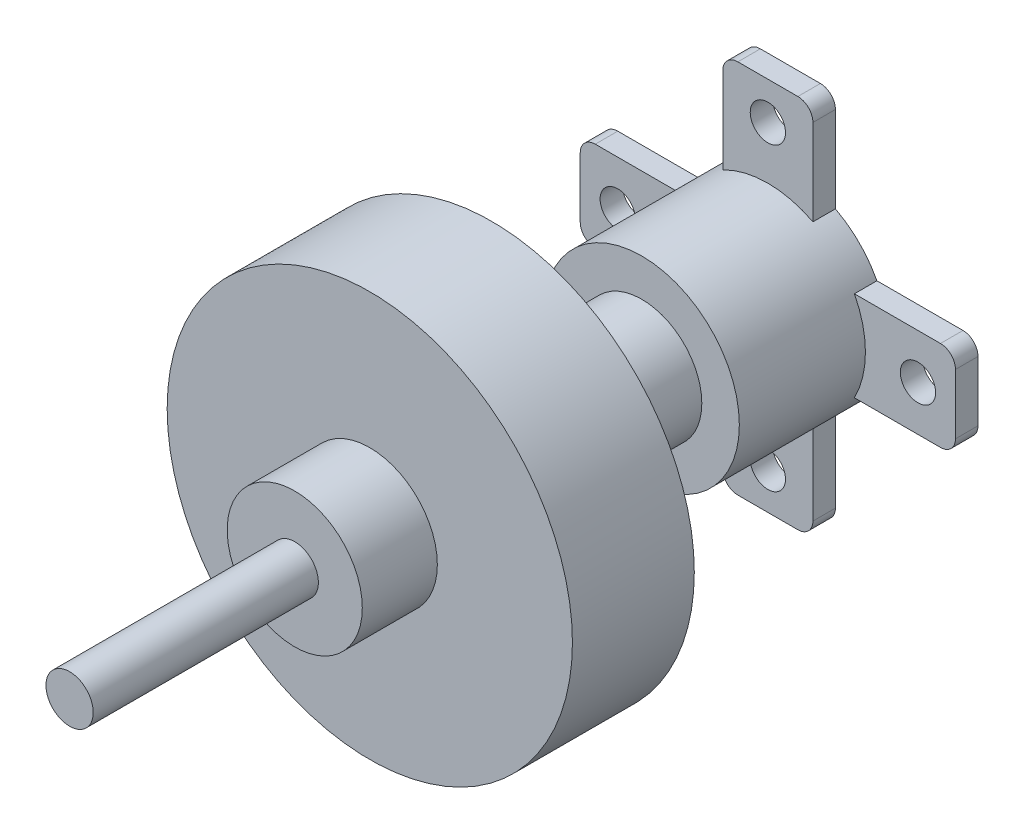
ISO-10303-21;
HEADER;
FILE_DESCRIPTION(('STEP AP214'),'2;1');
FILE_NAME('part.step','',(''),(''),'','','');
FILE_SCHEMA(('AUTOMOTIVE_DESIGN { 1 0 10303 214 1 1 1 1 }'));
ENDSEC;
DATA;
#1=APPLICATION_CONTEXT('core data for automotive mechanical design processes');
#2=APPLICATION_PROTOCOL_DEFINITION('international standard','automotive_design',2000,#1);
#3=PRODUCT_CONTEXT('',#1,'mechanical');
#4=PRODUCT('Part','Part','',(#3));
#5=PRODUCT_RELATED_PRODUCT_CATEGORY('part','',(#4));
#6=PRODUCT_DEFINITION_FORMATION('','',#4);
#7=PRODUCT_DEFINITION_CONTEXT('part definition',#1,'design');
#8=PRODUCT_DEFINITION('design','',#6,#7);
#9=PRODUCT_DEFINITION_SHAPE('','',#8);
#10=(LENGTH_UNIT() NAMED_UNIT(*) SI_UNIT(.MILLI.,.METRE.));
#11=(NAMED_UNIT(*) PLANE_ANGLE_UNIT() SI_UNIT($,.RADIAN.));
#12=(NAMED_UNIT(*) SI_UNIT($,.STERADIAN.) SOLID_ANGLE_UNIT());
#13=UNCERTAINTY_MEASURE_WITH_UNIT(LENGTH_MEASURE(1.E-05),#10,'distance_accuracy_value','');
#14=(GEOMETRIC_REPRESENTATION_CONTEXT(3) GLOBAL_UNCERTAINTY_ASSIGNED_CONTEXT((#13)) GLOBAL_UNIT_ASSIGNED_CONTEXT((#10,
#11,#12)) REPRESENTATION_CONTEXT('',''));
#15=CARTESIAN_POINT('',(0.,0.,0.));
#16=DIRECTION('',(0.,0.,1.));
#17=DIRECTION('',(1.,0.,0.));
#18=AXIS2_PLACEMENT_3D('',#15,#16,#17);
#19=CARTESIAN_POINT('',(0.,0.,31.52));
#20=DIRECTION('',(0.,0.,1.));
#21=DIRECTION('',(1.,0.,0.));
#22=AXIS2_PLACEMENT_3D('',#19,#20,#21);
#23=PLANE('',#22);
#24=CARTESIAN_POINT('',(0.,0.,31.52));
#25=DIRECTION('',(0.,0.,1.));
#26=DIRECTION('',(1.,0.,0.));
#27=AXIS2_PLACEMENT_3D('',#24,#25,#26);
#28=CIRCLE('',#27,4.5);
#29=CARTESIAN_POINT('',(4.5,0.,31.52));
#30=VERTEX_POINT('',#29);
#31=EDGE_CURVE('E56',#30,#30,#28,.T.);
#32=ORIENTED_EDGE('',*,*,#31,.T.);
#33=EDGE_LOOP('',(#32));
#34=FACE_BOUND('',#33,.T.);
#35=CARTESIAN_POINT('',(0.,0.,31.52));
#36=DIRECTION('',(0.,0.,1.));
#37=DIRECTION('',(1.,0.,0.));
#38=AXIS2_PLACEMENT_3D('',#35,#36,#37);
#39=CIRCLE('',#38,1.575);
#40=CARTESIAN_POINT('',(1.575,0.,31.52));
#41=VERTEX_POINT('',#40);
#42=EDGE_CURVE('E65',#41,#41,#39,.T.);
#43=ORIENTED_EDGE('',*,*,#42,.F.);
#44=EDGE_LOOP('',(#43));
#45=FACE_BOUND('',#44,.T.);
#46=ADVANCED_FACE('F40',(#34,#45),#23,.T.);
#47=CARTESIAN_POINT('',(0.,0.,26.52));
#48=DIRECTION('',(0.,0.,1.));
#49=DIRECTION('',(1.,0.,0.));
#50=AXIS2_PLACEMENT_3D('',#47,#48,#49);
#51=PLANE('',#50);
#52=CARTESIAN_POINT('',(0.,0.,26.52));
#53=DIRECTION('',(0.,0.,1.));
#54=DIRECTION('',(1.,0.,0.));
#55=AXIS2_PLACEMENT_3D('',#52,#53,#54);
#56=CIRCLE('',#55,13.5);
#57=CARTESIAN_POINT('',(13.5,0.,26.52));
#58=VERTEX_POINT('',#57);
#59=EDGE_CURVE('E51',#58,#58,#56,.T.);
#60=ORIENTED_EDGE('',*,*,#59,.T.);
#61=EDGE_LOOP('',(#60));
#62=FACE_BOUND('',#61,.T.);
#63=CARTESIAN_POINT('',(0.,0.,26.52));
#64=DIRECTION('',(0.,0.,1.));
#65=DIRECTION('',(1.,0.,0.));
#66=AXIS2_PLACEMENT_3D('',#63,#64,#65);
#67=CIRCLE('',#66,4.5);
#68=CARTESIAN_POINT('',(4.5,0.,26.52));
#69=VERTEX_POINT('',#68);
#70=EDGE_CURVE('E59',#69,#69,#67,.T.);
#71=ORIENTED_EDGE('',*,*,#70,.F.);
#72=EDGE_LOOP('',(#71));
#73=FACE_BOUND('',#72,.T.);
#74=ADVANCED_FACE('F81',(#62,#73),#51,.T.);
#75=CARTESIAN_POINT('',(0.,0.,18.4));
#76=DIRECTION('',(0.,0.,-1.));
#77=DIRECTION('',(-1.,0.,0.));
#78=AXIS2_PLACEMENT_3D('',#75,#76,#77);
#79=CYLINDRICAL_SURFACE('',#78,4.);
#80=CARTESIAN_POINT('',(0.,0.,18.4));
#81=DIRECTION('',(0.,0.,1.));
#82=DIRECTION('',(1.,0.,0.));
#83=AXIS2_PLACEMENT_3D('',#80,#81,#82);
#84=CIRCLE('',#83,4.);
#85=CARTESIAN_POINT('',(4.,0.,18.4));
#86=VERTEX_POINT('',#85);
#87=EDGE_CURVE('E11',#86,#86,#84,.T.);
#88=ORIENTED_EDGE('',*,*,#87,.F.);
#89=EDGE_LOOP('',(#88));
#90=FACE_BOUND('',#89,.T.);
#91=CARTESIAN_POINT('',(0.,0.,8.4));
#92=DIRECTION('',(0.,0.,1.));
#93=DIRECTION('',(1.,0.,0.));
#94=AXIS2_PLACEMENT_3D('',#91,#92,#93);
#95=CIRCLE('',#94,4.);
#96=CARTESIAN_POINT('',(4.,0.,8.4));
#97=VERTEX_POINT('',#96);
#98=EDGE_CURVE('E44',#97,#97,#95,.T.);
#99=ORIENTED_EDGE('',*,*,#98,.T.);
#100=EDGE_LOOP('',(#99));
#101=FACE_BOUND('',#100,.T.);
#102=ADVANCED_FACE('F42',(#90,#101),#79,.T.);
#103=CARTESIAN_POINT('',(0.,0.,8.4));
#104=DIRECTION('',(0.,0.,1.));
#105=DIRECTION('',(1.,0.,0.));
#106=AXIS2_PLACEMENT_3D('',#103,#104,#105);
#107=PLANE('',#106);
#108=ORIENTED_EDGE('',*,*,#98,.F.);
#109=EDGE_LOOP('',(#108));
#110=FACE_BOUND('',#109,.T.);
#111=ADVANCED_FACE('F98',(#110),#107,.F.);
#112=CARTESIAN_POINT('',(0.,0.,18.4));
#113=DIRECTION('',(0.,0.,1.));
#114=DIRECTION('',(1.,0.,0.));
#115=AXIS2_PLACEMENT_3D('',#112,#113,#114);
#116=PLANE('',#115);
#117=CARTESIAN_POINT('',(0.,0.,18.4));
#118=DIRECTION('',(0.,0.,1.));
#119=DIRECTION('',(1.,0.,0.));
#120=AXIS2_PLACEMENT_3D('',#117,#118,#119);
#121=CIRCLE('',#120,13.5);
#122=CARTESIAN_POINT('',(13.5,0.,18.4));
#123=VERTEX_POINT('',#122);
#124=EDGE_CURVE('E53',#123,#123,#121,.T.);
#125=ORIENTED_EDGE('',*,*,#124,.F.);
#126=EDGE_LOOP('',(#125));
#127=FACE_BOUND('',#126,.T.);
#128=ORIENTED_EDGE('',*,*,#87,.T.);
#129=EDGE_LOOP('',(#128));
#130=FACE_BOUND('',#129,.T.);
#131=ADVANCED_FACE('F95',(#127,#130),#116,.F.);
#132=CARTESIAN_POINT('',(0.,0.,26.52));
#133=DIRECTION('',(0.,0.,-1.));
#134=DIRECTION('',(-1.,0.,0.));
#135=AXIS2_PLACEMENT_3D('',#132,#133,#134);
#136=CYLINDRICAL_SURFACE('',#135,13.5);
#137=ORIENTED_EDGE('',*,*,#59,.F.);
#138=EDGE_LOOP('',(#137));
#139=FACE_BOUND('',#138,.T.);
#140=ORIENTED_EDGE('',*,*,#124,.T.);
#141=EDGE_LOOP('',(#140));
#142=FACE_BOUND('',#141,.T.);
#143=ADVANCED_FACE('F92',(#139,#142),#136,.T.);
#144=CARTESIAN_POINT('',(0.,0.,31.52));
#145=DIRECTION('',(0.,0.,-1.));
#146=DIRECTION('',(-1.,0.,0.));
#147=AXIS2_PLACEMENT_3D('',#144,#145,#146);
#148=CYLINDRICAL_SURFACE('',#147,4.5);
#149=ORIENTED_EDGE('',*,*,#31,.F.);
#150=EDGE_LOOP('',(#149));
#151=FACE_BOUND('',#150,.T.);
#152=ORIENTED_EDGE('',*,*,#70,.T.);
#153=EDGE_LOOP('',(#152));
#154=FACE_BOUND('',#153,.T.);
#155=ADVANCED_FACE('F76',(#151,#154),#148,.T.);
#156=CARTESIAN_POINT('',(0.,0.,46.52));
#157=DIRECTION('',(0.,0.,-1.));
#158=DIRECTION('',(-1.,0.,0.));
#159=AXIS2_PLACEMENT_3D('',#156,#157,#158);
#160=CYLINDRICAL_SURFACE('',#159,1.575);
#161=CARTESIAN_POINT('',(0.,0.,46.52));
#162=DIRECTION('',(0.,0.,1.));
#163=DIRECTION('',(1.,0.,0.));
#164=AXIS2_PLACEMENT_3D('',#161,#162,#163);
#165=CIRCLE('',#164,1.575);
#166=CARTESIAN_POINT('',(1.575,0.,46.52));
#167=VERTEX_POINT('',#166);
#168=EDGE_CURVE('E62',#167,#167,#165,.T.);
#169=ORIENTED_EDGE('',*,*,#168,.F.);
#170=EDGE_LOOP('',(#169));
#171=FACE_BOUND('',#170,.T.);
#172=ORIENTED_EDGE('',*,*,#42,.T.);
#173=EDGE_LOOP('',(#172));
#174=FACE_BOUND('',#173,.T.);
#175=ADVANCED_FACE('F73',(#171,#174),#160,.T.);
#176=CARTESIAN_POINT('',(0.,0.,46.52));
#177=DIRECTION('',(0.,0.,1.));
#178=DIRECTION('',(1.,0.,0.));
#179=AXIS2_PLACEMENT_3D('',#176,#177,#178);
#180=PLANE('',#179);
#181=ORIENTED_EDGE('',*,*,#168,.T.);
#182=EDGE_LOOP('',(#181));
#183=FACE_BOUND('',#182,.T.);
#184=ADVANCED_FACE('F71',(#183),#180,.T.);
#185=CLOSED_SHELL('',(#46,#74,#102,#111,#131,#143,#155,#175,#184));
#186=MANIFOLD_SOLID_BREP('B2',#185);
#187=CARTESIAN_POINT('',(0.,0.,8.4));
#188=DIRECTION('',(0.,0.,1.));
#189=DIRECTION('',(1.,0.,0.));
#190=AXIS2_PLACEMENT_3D('',#187,#188,#189);
#191=PLANE('',#190);
#192=CARTESIAN_POINT('',(0.,0.,8.4));
#193=DIRECTION('',(0.,0.,1.));
#194=DIRECTION('',(1.,0.,0.));
#195=AXIS2_PLACEMENT_3D('',#192,#193,#194);
#196=CIRCLE('',#195,6.5);
#197=CARTESIAN_POINT('',(6.5,0.,8.4));
#198=VERTEX_POINT('',#197);
#199=EDGE_CURVE('E38',#198,#198,#196,.T.);
#200=ORIENTED_EDGE('',*,*,#199,.T.);
#201=EDGE_LOOP('',(#200));
#202=FACE_BOUND('',#201,.T.);
#203=CARTESIAN_POINT('',(0.,0.,8.4));
#204=DIRECTION('',(0.,0.,1.));
#205=DIRECTION('',(1.,0.,0.));
#206=AXIS2_PLACEMENT_3D('',#203,#204,#205);
#207=CIRCLE('',#206,4.);
#208=CARTESIAN_POINT('',(4.,0.,8.4));
#209=VERTEX_POINT('',#208);
#210=EDGE_CURVE('E448',#209,#209,#207,.T.);
#211=ORIENTED_EDGE('',*,*,#210,.F.);
#212=EDGE_LOOP('',(#211));
#213=FACE_BOUND('',#212,.T.);
#214=ADVANCED_FACE('F170',(#202,#213),#191,.T.);
#215=CARTESIAN_POINT('',(0.,0.,8.4));
#216=DIRECTION('',(0.,0.,-1.));
#217=DIRECTION('',(-1.,0.,0.));
#218=AXIS2_PLACEMENT_3D('',#215,#216,#217);
#219=CYLINDRICAL_SURFACE('',#218,6.5);
#220=ORIENTED_EDGE('',*,*,#199,.F.);
#221=EDGE_LOOP('',(#220));
#222=FACE_BOUND('',#221,.T.);
#223=CARTESIAN_POINT('',(0.,0.,0.));
#224=DIRECTION('',(0.,0.,1.));
#225=DIRECTION('',(1.,0.,0.));
#226=AXIS2_PLACEMENT_3D('',#223,#224,#225);
#227=CIRCLE('',#226,6.5);
#228=CARTESIAN_POINT('',(5.76628129733541,-2.99999999999998,0.));
#229=VERTEX_POINT('',#228);
#230=CARTESIAN_POINT('',(5.76628129733539,3.00000000000002,0.));
#231=VERTEX_POINT('',#230);
#232=EDGE_CURVE('E270',#229,#231,#227,.T.);
#233=ORIENTED_EDGE('',*,*,#232,.T.);
#234=DIRECTION('',(0.,0.,1.));
#235=VECTOR('',#234,1.);
#236=CARTESIAN_POINT('',(5.76628129733539,3.00000000000002,-1.5));
#237=LINE('',#236,#235);
#238=CARTESIAN_POINT('',(5.76628129733539,3.00000000000002,-1.5));
#239=VERTEX_POINT('',#238);
#240=EDGE_CURVE('E405',#239,#231,#237,.T.);
#241=ORIENTED_EDGE('',*,*,#240,.F.);
#242=CARTESIAN_POINT('',(-1.23283788339035E-13,-1.24032728532343E-13,-1.5));
#243=DIRECTION('',(0.,0.,-1.));
#244=DIRECTION('',(1.,0.,0.));
#245=AXIS2_PLACEMENT_3D('',#242,#243,#244);
#246=CIRCLE('',#245,6.50000000000017);
#247=CARTESIAN_POINT('',(2.99999999999996,5.76628129733542,-1.5));
#248=VERTEX_POINT('',#247);
#249=EDGE_CURVE('E568',#248,#239,#246,.T.);
#250=ORIENTED_EDGE('',*,*,#249,.F.);
#251=DIRECTION('',(0.,0.,1.));
#252=VECTOR('',#251,1.);
#253=CARTESIAN_POINT('',(2.99999999999996,5.76628129733542,-1.5));
#254=LINE('',#253,#252);
#255=CARTESIAN_POINT('',(2.99999999999996,5.76628129733542,0.));
#256=VERTEX_POINT('',#255);
#257=EDGE_CURVE('E410',#248,#256,#254,.T.);
#258=ORIENTED_EDGE('',*,*,#257,.T.);
#259=CARTESIAN_POINT('',(-3.00000000000004,5.76628129733538,0.));
#260=VERTEX_POINT('',#259);
#261=EDGE_CURVE('E179',#256,#260,#227,.T.);
#262=ORIENTED_EDGE('',*,*,#261,.T.);
#263=DIRECTION('',(0.,0.,1.));
#264=VECTOR('',#263,1.);
#265=CARTESIAN_POINT('',(-3.00000000000004,5.76628129733538,-1.5));
#266=LINE('',#265,#264);
#267=CARTESIAN_POINT('',(-3.00000000000004,5.76628129733538,-1.5));
#268=VERTEX_POINT('',#267);
#269=EDGE_CURVE('E419',#268,#260,#266,.T.);
#270=ORIENTED_EDGE('',*,*,#269,.F.);
#271=CARTESIAN_POINT('',(1.24032728532342E-13,-1.23165366794353E-13,-1.5));
#272=DIRECTION('',(0.,0.,-1.));
#273=DIRECTION('',(1.,0.,0.));
#274=AXIS2_PLACEMENT_3D('',#271,#272,#273);
#275=CIRCLE('',#274,6.50000000000017);
#276=CARTESIAN_POINT('',(-5.76628129733543,2.99999999999994,-1.5));
#277=VERTEX_POINT('',#276);
#278=EDGE_CURVE('E556',#277,#268,#275,.T.);
#279=ORIENTED_EDGE('',*,*,#278,.F.);
#280=DIRECTION('',(0.,0.,1.));
#281=VECTOR('',#280,1.);
#282=CARTESIAN_POINT('',(-5.76628129733543,2.99999999999994,-1.5));
#283=LINE('',#282,#281);
#284=CARTESIAN_POINT('',(-5.76628129733543,2.99999999999994,0.));
#285=VERTEX_POINT('',#284);
#286=EDGE_CURVE('E424',#277,#285,#283,.T.);
#287=ORIENTED_EDGE('',*,*,#286,.T.);
#288=CARTESIAN_POINT('',(-5.76628129733537,-3.00000000000006,0.));
#289=VERTEX_POINT('',#288);
#290=EDGE_CURVE('E463',#285,#289,#227,.T.);
#291=ORIENTED_EDGE('',*,*,#290,.T.);
#292=DIRECTION('',(0.,0.,1.));
#293=VECTOR('',#292,1.);
#294=CARTESIAN_POINT('',(-5.76628129733537,-3.00000000000006,-1.5));
#295=LINE('',#294,#293);
#296=CARTESIAN_POINT('',(-5.76628129733537,-3.00000000000006,-1.5));
#297=VERTEX_POINT('',#296);
#298=EDGE_CURVE('E433',#297,#289,#295,.T.);
#299=ORIENTED_EDGE('',*,*,#298,.F.);
#300=CARTESIAN_POINT('',(1.23165366794353E-13,1.23415013525456E-13,-1.5));
#301=DIRECTION('',(0.,0.,-1.));
#302=DIRECTION('',(1.,0.,0.));
#303=AXIS2_PLACEMENT_3D('',#300,#301,#302);
#304=CIRCLE('',#303,6.50000000000017);
#305=CARTESIAN_POINT('',(-3.,-5.7662812973354,-1.5));
#306=VERTEX_POINT('',#305);
#307=EDGE_CURVE('E544',#306,#297,#304,.T.);
#308=ORIENTED_EDGE('',*,*,#307,.F.);
#309=DIRECTION('',(0.,0.,1.));
#310=VECTOR('',#309,1.);
#311=CARTESIAN_POINT('',(-3.,-5.7662812973354,-1.5));
#312=LINE('',#311,#310);
#313=CARTESIAN_POINT('',(-3.,-5.7662812973354,0.));
#314=VERTEX_POINT('',#313);
#315=EDGE_CURVE('E438',#306,#314,#312,.T.);
#316=ORIENTED_EDGE('',*,*,#315,.T.);
#317=CARTESIAN_POINT('',(3.,-5.7662812973354,0.));
#318=VERTEX_POINT('',#317);
#319=EDGE_CURVE('E465',#314,#318,#227,.T.);
#320=ORIENTED_EDGE('',*,*,#319,.T.);
#321=DIRECTION('',(0.,0.,1.));
#322=VECTOR('',#321,1.);
#323=CARTESIAN_POINT('',(3.,-5.7662812973354,-1.5));
#324=LINE('',#323,#322);
#325=CARTESIAN_POINT('',(3.,-5.7662812973354,-1.5));
#326=VERTEX_POINT('',#325);
#327=EDGE_CURVE('E447',#326,#318,#324,.T.);
#328=ORIENTED_EDGE('',*,*,#327,.F.);
#329=CARTESIAN_POINT('',(-1.22298005056366E-13,1.24900090270329E-13,-1.5));
#330=DIRECTION('',(0.,0.,-1.));
#331=DIRECTION('',(1.,0.,0.));
#332=AXIS2_PLACEMENT_3D('',#329,#330,#331);
#333=CIRCLE('',#332,6.50000000000017);
#334=CARTESIAN_POINT('',(5.76628129733541,-2.99999999999998,-1.5));
#335=VERTEX_POINT('',#334);
#336=EDGE_CURVE('E475',#335,#326,#333,.T.);
#337=ORIENTED_EDGE('',*,*,#336,.F.);
#338=DIRECTION('',(0.,0.,1.));
#339=VECTOR('',#338,1.);
#340=CARTESIAN_POINT('',(5.76628129733541,-2.99999999999998,-1.5));
#341=LINE('',#340,#339);
#342=EDGE_CURVE('E366',#335,#229,#341,.T.);
#343=ORIENTED_EDGE('',*,*,#342,.T.);
#344=EDGE_LOOP('',(#233,#241,#250,#258,#262,#270,#279,#287,#291,#299,#308,#316,#320,#328,#337,#343));
#345=FACE_BOUND('',#344,.T.);
#346=ADVANCED_FACE('F172',(#222,#345),#219,.T.);
#347=CARTESIAN_POINT('',(0.,0.,8.4));
#348=DIRECTION('',(0.,0.,-1.));
#349=DIRECTION('',(-1.,0.,0.));
#350=AXIS2_PLACEMENT_3D('',#347,#348,#349);
#351=CYLINDRICAL_SURFACE('',#350,4.);
#352=ORIENTED_EDGE('',*,*,#210,.T.);
#353=EDGE_LOOP('',(#352));
#354=FACE_BOUND('',#353,.T.);
#355=CARTESIAN_POINT('',(0.,0.,0.));
#356=DIRECTION('',(0.,0.,1.));
#357=DIRECTION('',(1.,0.,0.));
#358=AXIS2_PLACEMENT_3D('',#355,#356,#357);
#359=CIRCLE('',#358,4.);
#360=CARTESIAN_POINT('',(4.,0.,0.));
#361=VERTEX_POINT('',#360);
#362=EDGE_CURVE('E451',#361,#361,#359,.T.);
#363=ORIENTED_EDGE('',*,*,#362,.F.);
#364=EDGE_LOOP('',(#363));
#365=FACE_BOUND('',#364,.T.);
#366=ADVANCED_FACE('F594',(#354,#365),#351,.F.);
#367=CARTESIAN_POINT('',(-1.22298005056366E-13,1.24900090270329E-13,0.));
#368=DIRECTION('',(0.,0.,1.));
#369=DIRECTION('',(1.,0.,0.));
#370=AXIS2_PLACEMENT_3D('',#367,#368,#369);
#371=PLANE('',#370);
#372=ORIENTED_EDGE('',*,*,#362,.T.);
#373=EDGE_LOOP('',(#372));
#374=FACE_BOUND('',#373,.T.);
#375=ADVANCED_FACE('F600',(#374),#371,.T.);
#376=CARTESIAN_POINT('',(0.,10.,0.));
#377=DIRECTION('',(0.,0.,-1.));
#378=DIRECTION('',(-1.,0.,0.));
#379=AXIS2_PLACEMENT_3D('',#376,#377,#378);
#380=CIRCLE('',#379,1.175);
#381=CARTESIAN_POINT('',(-1.17500000000007,10.,0.));
#382=VERTEX_POINT('',#381);
#383=EDGE_CURVE('E747',#382,#382,#380,.T.);
#384=ORIENTED_EDGE('',*,*,#383,.T.);
#385=EDGE_LOOP('',(#384));
#386=FACE_BOUND('',#385,.T.);
#387=ORIENTED_EDGE('',*,*,#261,.F.);
#388=DIRECTION('',(0.,-1.,0.));
#389=VECTOR('',#388,1.);
#390=CARTESIAN_POINT('',(2.99999999999992,11.5,0.));
#391=LINE('',#390,#389);
#392=CARTESIAN_POINT('',(2.99999999999992,11.5,0.));
#393=VERTEX_POINT('',#392);
#394=EDGE_CURVE('E393',#393,#256,#391,.T.);
#395=ORIENTED_EDGE('',*,*,#394,.F.);
#396=CARTESIAN_POINT('',(1.99999999999992,11.5,0.));
#397=DIRECTION('',(0.,0.,-1.));
#398=DIRECTION('',(-1.,0.,0.));
#399=AXIS2_PLACEMENT_3D('',#396,#397,#398);
#400=CIRCLE('',#399,1.);
#401=CARTESIAN_POINT('',(1.99999999999991,12.5,0.));
#402=VERTEX_POINT('',#401);
#403=EDGE_CURVE('E391',#402,#393,#400,.T.);
#404=ORIENTED_EDGE('',*,*,#403,.F.);
#405=DIRECTION('',(1.,0.,0.));
#406=VECTOR('',#405,1.);
#407=CARTESIAN_POINT('',(-2.00000000000008,12.5,0.));
#408=LINE('',#407,#406);
#409=CARTESIAN_POINT('',(-2.00000000000008,12.5,0.));
#410=VERTEX_POINT('',#409);
#411=EDGE_CURVE('E388',#410,#402,#408,.T.);
#412=ORIENTED_EDGE('',*,*,#411,.F.);
#413=CARTESIAN_POINT('',(-2.00000000000008,11.5,0.));
#414=DIRECTION('',(0.,0.,-1.));
#415=DIRECTION('',(1.,0.,0.));
#416=AXIS2_PLACEMENT_3D('',#413,#414,#415);
#417=CIRCLE('',#416,1.);
#418=CARTESIAN_POINT('',(-3.00000000000008,11.5,0.));
#419=VERTEX_POINT('',#418);
#420=EDGE_CURVE('E386',#419,#410,#417,.T.);
#421=ORIENTED_EDGE('',*,*,#420,.F.);
#422=DIRECTION('',(0.,1.,0.));
#423=VECTOR('',#422,1.);
#424=CARTESIAN_POINT('',(-3.00000000000008,11.5,0.));
#425=LINE('',#424,#423);
#426=EDGE_CURVE('E389',#260,#419,#425,.T.);
#427=ORIENTED_EDGE('',*,*,#426,.F.);
#428=EDGE_LOOP('',(#387,#395,#404,#412,#421,#427));
#429=FACE_BOUND('',#428,.T.);
#430=ADVANCED_FACE('F723',(#386,#429),#371,.T.);
#431=CARTESIAN_POINT('',(-10.,-1.03519793366147E-13,0.));
#432=DIRECTION('',(0.,0.,-1.));
#433=DIRECTION('',(-1.,0.,0.));
#434=AXIS2_PLACEMENT_3D('',#431,#432,#433);
#435=CIRCLE('',#434,1.175);
#436=CARTESIAN_POINT('',(-11.175,-1.03519793366147E-13,0.));
#437=VERTEX_POINT('',#436);
#438=EDGE_CURVE('E809',#437,#437,#435,.T.);
#439=ORIENTED_EDGE('',*,*,#438,.T.);
#440=EDGE_LOOP('',(#439));
#441=FACE_BOUND('',#440,.T.);
#442=ORIENTED_EDGE('',*,*,#290,.F.);
#443=DIRECTION('',(1.,0.,0.));
#444=VECTOR('',#443,1.);
#445=CARTESIAN_POINT('',(-11.5,2.99999999999988,0.));
#446=LINE('',#445,#444);
#447=CARTESIAN_POINT('',(-11.5,2.99999999999988,0.));
#448=VERTEX_POINT('',#447);
#449=EDGE_CURVE('E385',#448,#285,#446,.T.);
#450=ORIENTED_EDGE('',*,*,#449,.F.);
#451=CARTESIAN_POINT('',(-11.5,1.99999999999988,0.));
#452=DIRECTION('',(0.,0.,-1.));
#453=DIRECTION('',(-1.,0.,0.));
#454=AXIS2_PLACEMENT_3D('',#451,#452,#453);
#455=CIRCLE('',#454,1.);
#456=CARTESIAN_POINT('',(-12.5,1.99999999999986,0.));
#457=VERTEX_POINT('',#456);
#458=EDGE_CURVE('E383',#457,#448,#455,.T.);
#459=ORIENTED_EDGE('',*,*,#458,.F.);
#460=DIRECTION('',(0.,1.,0.));
#461=VECTOR('',#460,1.);
#462=CARTESIAN_POINT('',(-12.5,-2.00000000000013,0.));
#463=LINE('',#462,#461);
#464=CARTESIAN_POINT('',(-12.5,-2.00000000000013,0.));
#465=VERTEX_POINT('',#464);
#466=EDGE_CURVE('E380',#465,#457,#463,.T.);
#467=ORIENTED_EDGE('',*,*,#466,.F.);
#468=CARTESIAN_POINT('',(-11.5,-2.00000000000012,0.));
#469=DIRECTION('',(0.,0.,-1.));
#470=DIRECTION('',(1.,0.,0.));
#471=AXIS2_PLACEMENT_3D('',#468,#469,#470);
#472=CIRCLE('',#471,1.);
#473=CARTESIAN_POINT('',(-11.5,-3.00000000000012,0.));
#474=VERTEX_POINT('',#473);
#475=EDGE_CURVE('E378',#474,#465,#472,.T.);
#476=ORIENTED_EDGE('',*,*,#475,.F.);
#477=DIRECTION('',(-1.,0.,0.));
#478=VECTOR('',#477,1.);
#479=CARTESIAN_POINT('',(-11.5,-3.00000000000012,0.));
#480=LINE('',#479,#478);
#481=EDGE_CURVE('E381',#289,#474,#480,.T.);
#482=ORIENTED_EDGE('',*,*,#481,.F.);
#483=EDGE_LOOP('',(#442,#450,#459,#467,#476,#482));
#484=FACE_BOUND('',#483,.T.);
#485=ADVANCED_FACE('F728',(#441,#484),#371,.T.);
#486=CARTESIAN_POINT('',(0.,-10.,0.));
#487=DIRECTION('',(0.,0.,-1.));
#488=DIRECTION('',(-1.,0.,0.));
#489=AXIS2_PLACEMENT_3D('',#486,#487,#488);
#490=CIRCLE('',#489,1.175);
#491=CARTESIAN_POINT('',(-1.175,-10.,0.));
#492=VERTEX_POINT('',#491);
#493=EDGE_CURVE('E534',#492,#492,#490,.T.);
#494=ORIENTED_EDGE('',*,*,#493,.T.);
#495=EDGE_LOOP('',(#494));
#496=FACE_BOUND('',#495,.T.);
#497=ORIENTED_EDGE('',*,*,#319,.F.);
#498=DIRECTION('',(0.,1.,0.));
#499=VECTOR('',#498,1.);
#500=CARTESIAN_POINT('',(-3.,-11.5,0.));
#501=LINE('',#500,#499);
#502=CARTESIAN_POINT('',(-3.,-11.5,0.));
#503=VERTEX_POINT('',#502);
#504=EDGE_CURVE('E377',#503,#314,#501,.T.);
#505=ORIENTED_EDGE('',*,*,#504,.F.);
#506=CARTESIAN_POINT('',(-2.,-11.5,0.));
#507=DIRECTION('',(0.,0.,-1.));
#508=DIRECTION('',(-1.,0.,0.));
#509=AXIS2_PLACEMENT_3D('',#506,#507,#508);
#510=CIRCLE('',#509,1.);
#511=CARTESIAN_POINT('',(-1.99999999999999,-12.5,0.));
#512=VERTEX_POINT('',#511);
#513=EDGE_CURVE('E375',#512,#503,#510,.T.);
#514=ORIENTED_EDGE('',*,*,#513,.F.);
#515=DIRECTION('',(-1.,0.,0.));
#516=VECTOR('',#515,1.);
#517=CARTESIAN_POINT('',(1.99999999999999,-12.5,0.));
#518=LINE('',#517,#516);
#519=CARTESIAN_POINT('',(1.99999999999999,-12.5,0.));
#520=VERTEX_POINT('',#519);
#521=EDGE_CURVE('E372',#520,#512,#518,.T.);
#522=ORIENTED_EDGE('',*,*,#521,.F.);
#523=CARTESIAN_POINT('',(2.,-11.5,0.));
#524=DIRECTION('',(0.,0.,-1.));
#525=DIRECTION('',(1.,0.,0.));
#526=AXIS2_PLACEMENT_3D('',#523,#524,#525);
#527=CIRCLE('',#526,1.);
#528=CARTESIAN_POINT('',(3.,-11.5,0.));
#529=VERTEX_POINT('',#528);
#530=EDGE_CURVE('E370',#529,#520,#527,.T.);
#531=ORIENTED_EDGE('',*,*,#530,.F.);
#532=DIRECTION('',(0.,-1.,0.));
#533=VECTOR('',#532,1.);
#534=CARTESIAN_POINT('',(3.,-11.5,0.));
#535=LINE('',#534,#533);
#536=EDGE_CURVE('E373',#318,#529,#535,.T.);
#537=ORIENTED_EDGE('',*,*,#536,.F.);
#538=EDGE_LOOP('',(#497,#505,#514,#522,#531,#537));
#539=FACE_BOUND('',#538,.T.);
#540=ADVANCED_FACE('F731',(#496,#539),#371,.T.);
#541=CARTESIAN_POINT('',(10.,0.,0.));
#542=DIRECTION('',(0.,0.,-1.));
#543=DIRECTION('',(-1.,0.,0.));
#544=AXIS2_PLACEMENT_3D('',#541,#542,#543);
#545=CIRCLE('',#544,1.175);
#546=CARTESIAN_POINT('',(8.825,0.,0.));
#547=VERTEX_POINT('',#546);
#548=EDGE_CURVE('E739',#547,#547,#545,.T.);
#549=ORIENTED_EDGE('',*,*,#548,.T.);
#550=EDGE_LOOP('',(#549));
#551=FACE_BOUND('',#550,.T.);
#552=ORIENTED_EDGE('',*,*,#232,.F.);
#553=DIRECTION('',(-1.,0.,0.));
#554=VECTOR('',#553,1.);
#555=CARTESIAN_POINT('',(11.5,-2.99999999999996,0.));
#556=LINE('',#555,#554);
#557=CARTESIAN_POINT('',(11.5,-2.99999999999996,0.));
#558=VERTEX_POINT('',#557);
#559=EDGE_CURVE('E399',#558,#229,#556,.T.);
#560=ORIENTED_EDGE('',*,*,#559,.F.);
#561=CARTESIAN_POINT('',(11.5,-1.99999999999996,0.));
#562=DIRECTION('',(0.,0.,-1.));
#563=DIRECTION('',(-1.,0.,0.));
#564=AXIS2_PLACEMENT_3D('',#561,#562,#563);
#565=CIRCLE('',#564,1.);
#566=CARTESIAN_POINT('',(12.5,-1.99999999999995,0.));
#567=VERTEX_POINT('',#566);
#568=EDGE_CURVE('E397',#567,#558,#565,.T.);
#569=ORIENTED_EDGE('',*,*,#568,.F.);
#570=DIRECTION('',(0.,-1.,0.));
#571=VECTOR('',#570,1.);
#572=CARTESIAN_POINT('',(12.5,2.00000000000004,0.));
#573=LINE('',#572,#571);
#574=CARTESIAN_POINT('',(12.5,2.00000000000004,0.));
#575=VERTEX_POINT('',#574);
#576=EDGE_CURVE('E357',#575,#567,#573,.T.);
#577=ORIENTED_EDGE('',*,*,#576,.F.);
#578=CARTESIAN_POINT('',(11.5,2.00000000000004,0.));
#579=DIRECTION('',(0.,0.,-1.));
#580=DIRECTION('',(1.,0.,0.));
#581=AXIS2_PLACEMENT_3D('',#578,#579,#580);
#582=CIRCLE('',#581,1.);
#583=CARTESIAN_POINT('',(11.5,3.00000000000004,0.));
#584=VERTEX_POINT('',#583);
#585=EDGE_CURVE('E394',#584,#575,#582,.T.);
#586=ORIENTED_EDGE('',*,*,#585,.F.);
#587=DIRECTION('',(1.,0.,0.));
#588=VECTOR('',#587,1.);
#589=CARTESIAN_POINT('',(11.5,3.00000000000004,0.));
#590=LINE('',#589,#588);
#591=EDGE_CURVE('E187',#231,#584,#590,.T.);
#592=ORIENTED_EDGE('',*,*,#591,.F.);
#593=EDGE_LOOP('',(#552,#560,#569,#577,#586,#592));
#594=FACE_BOUND('',#593,.T.);
#595=ADVANCED_FACE('F575',(#551,#594),#371,.T.);
#596=CARTESIAN_POINT('',(-1.22298005056366E-13,1.24900090270329E-13,-1.5));
#597=DIRECTION('',(0.,0.,1.));
#598=DIRECTION('',(1.,0.,0.));
#599=AXIS2_PLACEMENT_3D('',#596,#597,#598);
#600=PLANE('',#599);
#601=CARTESIAN_POINT('',(0.,10.,-1.5));
#602=DIRECTION('',(0.,0.,-1.));
#603=DIRECTION('',(-1.,0.,0.));
#604=AXIS2_PLACEMENT_3D('',#601,#602,#603);
#605=CIRCLE('',#604,1.175);
#606=CARTESIAN_POINT('',(-1.17500000000007,10.,-1.5));
#607=VERTEX_POINT('',#606);
#608=EDGE_CURVE('E742',#607,#607,#605,.T.);
#609=ORIENTED_EDGE('',*,*,#608,.F.);
#610=EDGE_LOOP('',(#609));
#611=FACE_BOUND('',#610,.T.);
#612=CARTESIAN_POINT('',(0.,-10.,-1.5));
#613=DIRECTION('',(0.,0.,-1.));
#614=DIRECTION('',(-1.,0.,0.));
#615=AXIS2_PLACEMENT_3D('',#612,#613,#614);
#616=CIRCLE('',#615,1.175);
#617=CARTESIAN_POINT('',(-1.175,-10.,-1.5));
#618=VERTEX_POINT('',#617);
#619=EDGE_CURVE('E485',#618,#618,#616,.T.);
#620=ORIENTED_EDGE('',*,*,#619,.F.);
#621=EDGE_LOOP('',(#620));
#622=FACE_BOUND('',#621,.T.);
#623=ORIENTED_EDGE('',*,*,#336,.T.);
#624=DIRECTION('',(0.,-1.,0.));
#625=VECTOR('',#624,1.);
#626=CARTESIAN_POINT('',(3.,-11.5,-1.5));
#627=LINE('',#626,#625);
#628=CARTESIAN_POINT('',(3.,-11.5,-1.5));
#629=VERTEX_POINT('',#628);
#630=EDGE_CURVE('E279',#326,#629,#627,.T.);
#631=ORIENTED_EDGE('',*,*,#630,.T.);
#632=CARTESIAN_POINT('',(2.,-11.5,-1.5));
#633=DIRECTION('',(0.,0.,-1.));
#634=DIRECTION('',(1.,0.,0.));
#635=AXIS2_PLACEMENT_3D('',#632,#633,#634);
#636=CIRCLE('',#635,1.);
#637=CARTESIAN_POINT('',(1.99999999999999,-12.5,-1.5));
#638=VERTEX_POINT('',#637);
#639=EDGE_CURVE('E531',#629,#638,#636,.T.);
#640=ORIENTED_EDGE('',*,*,#639,.T.);
#641=DIRECTION('',(-1.,0.,0.));
#642=VECTOR('',#641,1.);
#643=CARTESIAN_POINT('',(1.99999999999999,-12.5,-1.5));
#644=LINE('',#643,#642);
#645=CARTESIAN_POINT('',(-1.99999999999999,-12.5,-1.5));
#646=VERTEX_POINT('',#645);
#647=EDGE_CURVE('E538',#638,#646,#644,.T.);
#648=ORIENTED_EDGE('',*,*,#647,.T.);
#649=CARTESIAN_POINT('',(-2.,-11.5,-1.5));
#650=DIRECTION('',(0.,0.,-1.));
#651=DIRECTION('',(-1.,0.,0.));
#652=AXIS2_PLACEMENT_3D('',#649,#650,#651);
#653=CIRCLE('',#652,1.);
#654=CARTESIAN_POINT('',(-3.,-11.5,-1.5));
#655=VERTEX_POINT('',#654);
#656=EDGE_CURVE('E540',#646,#655,#653,.T.);
#657=ORIENTED_EDGE('',*,*,#656,.T.);
#658=DIRECTION('',(0.,1.,0.));
#659=VECTOR('',#658,1.);
#660=CARTESIAN_POINT('',(-3.,-11.5,-1.5));
#661=LINE('',#660,#659);
#662=EDGE_CURVE('E542',#655,#306,#661,.T.);
#663=ORIENTED_EDGE('',*,*,#662,.T.);
#664=ORIENTED_EDGE('',*,*,#307,.T.);
#665=DIRECTION('',(-1.,0.,0.));
#666=VECTOR('',#665,1.);
#667=CARTESIAN_POINT('',(-11.5,-3.00000000000012,-1.5));
#668=LINE('',#667,#666);
#669=CARTESIAN_POINT('',(-11.5,-3.00000000000012,-1.5));
#670=VERTEX_POINT('',#669);
#671=EDGE_CURVE('E546',#297,#670,#668,.T.);
#672=ORIENTED_EDGE('',*,*,#671,.T.);
#673=CARTESIAN_POINT('',(-11.5,-2.00000000000012,-1.5));
#674=DIRECTION('',(0.,0.,-1.));
#675=DIRECTION('',(1.,0.,0.));
#676=AXIS2_PLACEMENT_3D('',#673,#674,#675);
#677=CIRCLE('',#676,1.);
#678=CARTESIAN_POINT('',(-12.5,-2.00000000000013,-1.5));
#679=VERTEX_POINT('',#678);
#680=EDGE_CURVE('E548',#670,#679,#677,.T.);
#681=ORIENTED_EDGE('',*,*,#680,.T.);
#682=DIRECTION('',(0.,1.,0.));
#683=VECTOR('',#682,1.);
#684=CARTESIAN_POINT('',(-12.5,-2.00000000000013,-1.5));
#685=LINE('',#684,#683);
#686=CARTESIAN_POINT('',(-12.5,1.99999999999986,-1.5));
#687=VERTEX_POINT('',#686);
#688=EDGE_CURVE('E550',#679,#687,#685,.T.);
#689=ORIENTED_EDGE('',*,*,#688,.T.);
#690=CARTESIAN_POINT('',(-11.5,1.99999999999988,-1.5));
#691=DIRECTION('',(0.,0.,-1.));
#692=DIRECTION('',(-1.,0.,0.));
#693=AXIS2_PLACEMENT_3D('',#690,#691,#692);
#694=CIRCLE('',#693,1.);
#695=CARTESIAN_POINT('',(-11.5,2.99999999999988,-1.5));
#696=VERTEX_POINT('',#695);
#697=EDGE_CURVE('E552',#687,#696,#694,.T.);
#698=ORIENTED_EDGE('',*,*,#697,.T.);
#699=DIRECTION('',(1.,0.,0.));
#700=VECTOR('',#699,1.);
#701=CARTESIAN_POINT('',(-11.5,2.99999999999988,-1.5));
#702=LINE('',#701,#700);
#703=EDGE_CURVE('E554',#696,#277,#702,.T.);
#704=ORIENTED_EDGE('',*,*,#703,.T.);
#705=ORIENTED_EDGE('',*,*,#278,.T.);
#706=DIRECTION('',(0.,1.,0.));
#707=VECTOR('',#706,1.);
#708=CARTESIAN_POINT('',(-3.00000000000008,11.5,-1.5));
#709=LINE('',#708,#707);
#710=CARTESIAN_POINT('',(-3.00000000000008,11.5,-1.5));
#711=VERTEX_POINT('',#710);
#712=EDGE_CURVE('E558',#268,#711,#709,.T.);
#713=ORIENTED_EDGE('',*,*,#712,.T.);
#714=CARTESIAN_POINT('',(-2.00000000000008,11.5,-1.5));
#715=DIRECTION('',(0.,0.,-1.));
#716=DIRECTION('',(1.,0.,0.));
#717=AXIS2_PLACEMENT_3D('',#714,#715,#716);
#718=CIRCLE('',#717,1.);
#719=CARTESIAN_POINT('',(-2.00000000000008,12.5,-1.5));
#720=VERTEX_POINT('',#719);
#721=EDGE_CURVE('E560',#711,#720,#718,.T.);
#722=ORIENTED_EDGE('',*,*,#721,.T.);
#723=DIRECTION('',(1.,0.,0.));
#724=VECTOR('',#723,1.);
#725=CARTESIAN_POINT('',(-2.00000000000008,12.5,-1.5));
#726=LINE('',#725,#724);
#727=CARTESIAN_POINT('',(1.99999999999991,12.5,-1.5));
#728=VERTEX_POINT('',#727);
#729=EDGE_CURVE('E562',#720,#728,#726,.T.);
#730=ORIENTED_EDGE('',*,*,#729,.T.);
#731=CARTESIAN_POINT('',(1.99999999999992,11.5,-1.5));
#732=DIRECTION('',(0.,0.,-1.));
#733=DIRECTION('',(-1.,0.,0.));
#734=AXIS2_PLACEMENT_3D('',#731,#732,#733);
#735=CIRCLE('',#734,1.);
#736=CARTESIAN_POINT('',(2.99999999999992,11.5,-1.5));
#737=VERTEX_POINT('',#736);
#738=EDGE_CURVE('E564',#728,#737,#735,.T.);
#739=ORIENTED_EDGE('',*,*,#738,.T.);
#740=DIRECTION('',(0.,-1.,0.));
#741=VECTOR('',#740,1.);
#742=CARTESIAN_POINT('',(2.99999999999992,11.5,-1.5));
#743=LINE('',#742,#741);
#744=EDGE_CURVE('E566',#737,#248,#743,.T.);
#745=ORIENTED_EDGE('',*,*,#744,.T.);
#746=ORIENTED_EDGE('',*,*,#249,.T.);
#747=DIRECTION('',(1.,0.,0.));
#748=VECTOR('',#747,1.);
#749=CARTESIAN_POINT('',(11.5,3.00000000000004,-1.5));
#750=LINE('',#749,#748);
#751=CARTESIAN_POINT('',(11.5,3.00000000000004,-1.5));
#752=VERTEX_POINT('',#751);
#753=EDGE_CURVE('E570',#239,#752,#750,.T.);
#754=ORIENTED_EDGE('',*,*,#753,.T.);
#755=CARTESIAN_POINT('',(11.5,2.00000000000004,-1.5));
#756=DIRECTION('',(0.,0.,-1.));
#757=DIRECTION('',(1.,0.,0.));
#758=AXIS2_PLACEMENT_3D('',#755,#756,#757);
#759=CIRCLE('',#758,1.);
#760=CARTESIAN_POINT('',(12.5,2.00000000000004,-1.5));
#761=VERTEX_POINT('',#760);
#762=EDGE_CURVE('E348',#752,#761,#759,.T.);
#763=ORIENTED_EDGE('',*,*,#762,.T.);
#764=DIRECTION('',(0.,-1.,0.));
#765=VECTOR('',#764,1.);
#766=CARTESIAN_POINT('',(12.5,2.00000000000004,-1.5));
#767=LINE('',#766,#765);
#768=CARTESIAN_POINT('',(12.5,-1.99999999999995,-1.5));
#769=VERTEX_POINT('',#768);
#770=EDGE_CURVE('E340',#761,#769,#767,.T.);
#771=ORIENTED_EDGE('',*,*,#770,.T.);
#772=CARTESIAN_POINT('',(11.5,-1.99999999999996,-1.5));
#773=DIRECTION('',(0.,0.,-1.));
#774=DIRECTION('',(-1.,0.,0.));
#775=AXIS2_PLACEMENT_3D('',#772,#773,#774);
#776=CIRCLE('',#775,1.);
#777=CARTESIAN_POINT('',(11.5,-2.99999999999996,-1.5));
#778=VERTEX_POINT('',#777);
#779=EDGE_CURVE('E345',#769,#778,#776,.T.);
#780=ORIENTED_EDGE('',*,*,#779,.T.);
#781=DIRECTION('',(-1.,0.,0.));
#782=VECTOR('',#781,1.);
#783=CARTESIAN_POINT('',(11.5,-2.99999999999996,-1.5));
#784=LINE('',#783,#782);
#785=EDGE_CURVE('E196',#778,#335,#784,.T.);
#786=ORIENTED_EDGE('',*,*,#785,.T.);
#787=EDGE_LOOP('',(#623,#631,#640,#648,#657,#663,#664,#672,#681,#689,#698,#704,#705,#713,#722,
#730,#739,#745,#746,#754,#763,#771,#780,#786));
#788=FACE_BOUND('',#787,.T.);
#789=CARTESIAN_POINT('',(10.,0.,-1.5));
#790=DIRECTION('',(0.,0.,-1.));
#791=DIRECTION('',(-1.,0.,0.));
#792=AXIS2_PLACEMENT_3D('',#789,#790,#791);
#793=CIRCLE('',#792,1.175);
#794=CARTESIAN_POINT('',(8.825,0.,-1.5));
#795=VERTEX_POINT('',#794);
#796=EDGE_CURVE('E741',#795,#795,#793,.T.);
#797=ORIENTED_EDGE('',*,*,#796,.F.);
#798=EDGE_LOOP('',(#797));
#799=FACE_BOUND('',#798,.T.);
#800=CARTESIAN_POINT('',(-10.,-1.03519793366147E-13,-1.5));
#801=DIRECTION('',(0.,0.,-1.));
#802=DIRECTION('',(-1.,0.,0.));
#803=AXIS2_PLACEMENT_3D('',#800,#801,#802);
#804=CIRCLE('',#803,1.175);
#805=CARTESIAN_POINT('',(-11.175,-1.03519793366147E-13,-1.5));
#806=VERTEX_POINT('',#805);
#807=EDGE_CURVE('E810',#806,#806,#804,.T.);
#808=ORIENTED_EDGE('',*,*,#807,.F.);
#809=EDGE_LOOP('',(#808));
#810=FACE_BOUND('',#809,.T.);
#811=ADVANCED_FACE('F342',(#611,#622,#788,#799,#810),#600,.F.);
#812=CARTESIAN_POINT('',(3.,-11.5,-1.5));
#813=DIRECTION('',(-1.,0.,0.));
#814=DIRECTION('',(0.,-1.,0.));
#815=AXIS2_PLACEMENT_3D('',#812,#813,#814);
#816=PLANE('',#815);
#817=ORIENTED_EDGE('',*,*,#536,.T.);
#818=DIRECTION('',(0.,0.,1.));
#819=VECTOR('',#818,1.);
#820=CARTESIAN_POINT('',(3.,-11.5,-1.5));
#821=LINE('',#820,#819);
#822=EDGE_CURVE('E444',#629,#529,#821,.T.);
#823=ORIENTED_EDGE('',*,*,#822,.F.);
#824=ORIENTED_EDGE('',*,*,#630,.F.);
#825=ORIENTED_EDGE('',*,*,#327,.T.);
#826=EDGE_LOOP('',(#817,#823,#824,#825));
#827=FACE_BOUND('',#826,.T.);
#828=ADVANCED_FACE('F602',(#827),#816,.F.);
#829=CARTESIAN_POINT('',(2.,-11.5,-1.5));
#830=DIRECTION('',(0.,0.,1.));
#831=DIRECTION('',(1.,0.,0.));
#832=AXIS2_PLACEMENT_3D('',#829,#830,#831);
#833=CYLINDRICAL_SURFACE('',#832,1.);
#834=ORIENTED_EDGE('',*,*,#530,.T.);
#835=DIRECTION('',(0.,0.,1.));
#836=VECTOR('',#835,1.);
#837=CARTESIAN_POINT('',(1.99999999999999,-12.5,-1.5));
#838=LINE('',#837,#836);
#839=EDGE_CURVE('E441',#638,#520,#838,.T.);
#840=ORIENTED_EDGE('',*,*,#839,.F.);
#841=ORIENTED_EDGE('',*,*,#639,.F.);
#842=ORIENTED_EDGE('',*,*,#822,.T.);
#843=EDGE_LOOP('',(#834,#840,#841,#842));
#844=FACE_BOUND('',#843,.T.);
#845=ADVANCED_FACE('F605',(#844),#833,.T.);
#846=CARTESIAN_POINT('',(1.99999999999999,-12.5,-1.5));
#847=DIRECTION('',(0.,1.,0.));
#848=DIRECTION('',(0.,0.,1.));
#849=AXIS2_PLACEMENT_3D('',#846,#847,#848);
#850=PLANE('',#849);
#851=ORIENTED_EDGE('',*,*,#521,.T.);
#852=DIRECTION('',(0.,0.,1.));
#853=VECTOR('',#852,1.);
#854=CARTESIAN_POINT('',(-1.99999999999999,-12.5,-1.5));
#855=LINE('',#854,#853);
#856=EDGE_CURVE('E437',#646,#512,#855,.T.);
#857=ORIENTED_EDGE('',*,*,#856,.F.);
#858=ORIENTED_EDGE('',*,*,#647,.F.);
#859=ORIENTED_EDGE('',*,*,#839,.T.);
#860=EDGE_LOOP('',(#851,#857,#858,#859));
#861=FACE_BOUND('',#860,.T.);
#862=ADVANCED_FACE('F608',(#861),#850,.F.);
#863=CARTESIAN_POINT('',(-2.,-11.5,-1.5));
#864=DIRECTION('',(0.,0.,1.));
#865=DIRECTION('',(1.,0.,0.));
#866=AXIS2_PLACEMENT_3D('',#863,#864,#865);
#867=CYLINDRICAL_SURFACE('',#866,1.);
#868=ORIENTED_EDGE('',*,*,#513,.T.);
#869=DIRECTION('',(0.,0.,1.));
#870=VECTOR('',#869,1.);
#871=CARTESIAN_POINT('',(-3.,-11.5,-1.5));
#872=LINE('',#871,#870);
#873=EDGE_CURVE('E434',#655,#503,#872,.T.);
#874=ORIENTED_EDGE('',*,*,#873,.F.);
#875=ORIENTED_EDGE('',*,*,#656,.F.);
#876=ORIENTED_EDGE('',*,*,#856,.T.);
#877=EDGE_LOOP('',(#868,#874,#875,#876));
#878=FACE_BOUND('',#877,.T.);
#879=ADVANCED_FACE('F612',(#878),#867,.T.);
#880=CARTESIAN_POINT('',(-3.,-11.5,-1.5));
#881=DIRECTION('',(1.,0.,0.));
#882=DIRECTION('',(0.,1.,0.));
#883=AXIS2_PLACEMENT_3D('',#880,#881,#882);
#884=PLANE('',#883);
#885=ORIENTED_EDGE('',*,*,#504,.T.);
#886=ORIENTED_EDGE('',*,*,#315,.F.);
#887=ORIENTED_EDGE('',*,*,#662,.F.);
#888=ORIENTED_EDGE('',*,*,#873,.T.);
#889=EDGE_LOOP('',(#885,#886,#887,#888));
#890=FACE_BOUND('',#889,.T.);
#891=ADVANCED_FACE('F616',(#890),#884,.F.);
#892=CARTESIAN_POINT('',(-11.5,-3.00000000000012,-1.5));
#893=DIRECTION('',(0.,1.,0.));
#894=DIRECTION('',(-1.,0.,0.));
#895=AXIS2_PLACEMENT_3D('',#892,#893,#894);
#896=PLANE('',#895);
#897=ORIENTED_EDGE('',*,*,#481,.T.);
#898=DIRECTION('',(0.,0.,1.));
#899=VECTOR('',#898,1.);
#900=CARTESIAN_POINT('',(-11.5,-3.00000000000012,-1.5));
#901=LINE('',#900,#899);
#902=EDGE_CURVE('E430',#670,#474,#901,.T.);
#903=ORIENTED_EDGE('',*,*,#902,.F.);
#904=ORIENTED_EDGE('',*,*,#671,.F.);
#905=ORIENTED_EDGE('',*,*,#298,.T.);
#906=EDGE_LOOP('',(#897,#903,#904,#905));
#907=FACE_BOUND('',#906,.T.);
#908=ADVANCED_FACE('F620',(#907),#896,.F.);
#909=CARTESIAN_POINT('',(-11.5,-2.00000000000012,-1.5));
#910=DIRECTION('',(0.,0.,1.));
#911=DIRECTION('',(1.,0.,0.));
#912=AXIS2_PLACEMENT_3D('',#909,#910,#911);
#913=CYLINDRICAL_SURFACE('',#912,1.);
#914=ORIENTED_EDGE('',*,*,#475,.T.);
#915=DIRECTION('',(0.,0.,1.));
#916=VECTOR('',#915,1.);
#917=CARTESIAN_POINT('',(-12.5,-2.00000000000013,-1.5));
#918=LINE('',#917,#916);
#919=EDGE_CURVE('E427',#679,#465,#918,.T.);
#920=ORIENTED_EDGE('',*,*,#919,.F.);
#921=ORIENTED_EDGE('',*,*,#680,.F.);
#922=ORIENTED_EDGE('',*,*,#902,.T.);
#923=EDGE_LOOP('',(#914,#920,#921,#922));
#924=FACE_BOUND('',#923,.T.);
#925=ADVANCED_FACE('F624',(#924),#913,.T.);
#926=CARTESIAN_POINT('',(-12.5,-2.00000000000013,-1.5));
#927=DIRECTION('',(1.,0.,0.));
#928=DIRECTION('',(0.,1.,0.));
#929=AXIS2_PLACEMENT_3D('',#926,#927,#928);
#930=PLANE('',#929);
#931=ORIENTED_EDGE('',*,*,#466,.T.);
#932=DIRECTION('',(0.,0.,1.));
#933=VECTOR('',#932,1.);
#934=CARTESIAN_POINT('',(-12.5,1.99999999999986,-1.5));
#935=LINE('',#934,#933);
#936=EDGE_CURVE('E423',#687,#457,#935,.T.);
#937=ORIENTED_EDGE('',*,*,#936,.F.);
#938=ORIENTED_EDGE('',*,*,#688,.F.);
#939=ORIENTED_EDGE('',*,*,#919,.T.);
#940=EDGE_LOOP('',(#931,#937,#938,#939));
#941=FACE_BOUND('',#940,.T.);
#942=ADVANCED_FACE('F628',(#941),#930,.F.);
#943=CARTESIAN_POINT('',(-11.5,1.99999999999988,-1.5));
#944=DIRECTION('',(0.,0.,1.));
#945=DIRECTION('',(1.,0.,0.));
#946=AXIS2_PLACEMENT_3D('',#943,#944,#945);
#947=CYLINDRICAL_SURFACE('',#946,1.);
#948=ORIENTED_EDGE('',*,*,#458,.T.);
#949=DIRECTION('',(0.,0.,1.));
#950=VECTOR('',#949,1.);
#951=CARTESIAN_POINT('',(-11.5,2.99999999999988,-1.5));
#952=LINE('',#951,#950);
#953=EDGE_CURVE('E420',#696,#448,#952,.T.);
#954=ORIENTED_EDGE('',*,*,#953,.F.);
#955=ORIENTED_EDGE('',*,*,#697,.F.);
#956=ORIENTED_EDGE('',*,*,#936,.T.);
#957=EDGE_LOOP('',(#948,#954,#955,#956));
#958=FACE_BOUND('',#957,.T.);
#959=ADVANCED_FACE('F632',(#958),#947,.T.);
#960=CARTESIAN_POINT('',(-11.5,2.99999999999988,-1.5));
#961=DIRECTION('',(0.,-1.,0.));
#962=DIRECTION('',(1.,0.,0.));
#963=AXIS2_PLACEMENT_3D('',#960,#961,#962);
#964=PLANE('',#963);
#965=ORIENTED_EDGE('',*,*,#449,.T.);
#966=ORIENTED_EDGE('',*,*,#286,.F.);
#967=ORIENTED_EDGE('',*,*,#703,.F.);
#968=ORIENTED_EDGE('',*,*,#953,.T.);
#969=EDGE_LOOP('',(#965,#966,#967,#968));
#970=FACE_BOUND('',#969,.T.);
#971=ADVANCED_FACE('F636',(#970),#964,.F.);
#972=CARTESIAN_POINT('',(-3.00000000000008,11.5,-1.5));
#973=DIRECTION('',(1.,0.,0.));
#974=DIRECTION('',(0.,1.,0.));
#975=AXIS2_PLACEMENT_3D('',#972,#973,#974);
#976=PLANE('',#975);
#977=ORIENTED_EDGE('',*,*,#426,.T.);
#978=DIRECTION('',(0.,0.,1.));
#979=VECTOR('',#978,1.);
#980=CARTESIAN_POINT('',(-3.00000000000008,11.5,-1.5));
#981=LINE('',#980,#979);
#982=EDGE_CURVE('E416',#711,#419,#981,.T.);
#983=ORIENTED_EDGE('',*,*,#982,.F.);
#984=ORIENTED_EDGE('',*,*,#712,.F.);
#985=ORIENTED_EDGE('',*,*,#269,.T.);
#986=EDGE_LOOP('',(#977,#983,#984,#985));
#987=FACE_BOUND('',#986,.T.);
#988=ADVANCED_FACE('F640',(#987),#976,.F.);
#989=CARTESIAN_POINT('',(-2.00000000000008,11.5,-1.5));
#990=DIRECTION('',(0.,0.,1.));
#991=DIRECTION('',(1.,0.,0.));
#992=AXIS2_PLACEMENT_3D('',#989,#990,#991);
#993=CYLINDRICAL_SURFACE('',#992,1.);
#994=ORIENTED_EDGE('',*,*,#420,.T.);
#995=DIRECTION('',(0.,0.,1.));
#996=VECTOR('',#995,1.);
#997=CARTESIAN_POINT('',(-2.00000000000008,12.5,-1.5));
#998=LINE('',#997,#996);
#999=EDGE_CURVE('E413',#720,#410,#998,.T.);
#1000=ORIENTED_EDGE('',*,*,#999,.F.);
#1001=ORIENTED_EDGE('',*,*,#721,.F.);
#1002=ORIENTED_EDGE('',*,*,#982,.T.);
#1003=EDGE_LOOP('',(#994,#1000,#1001,#1002));
#1004=FACE_BOUND('',#1003,.T.);
#1005=ADVANCED_FACE('F644',(#1004),#993,.T.);
#1006=CARTESIAN_POINT('',(-2.00000000000008,12.5,-1.5));
#1007=DIRECTION('',(0.,-1.,0.));
#1008=DIRECTION('',(1.,0.,0.));
#1009=AXIS2_PLACEMENT_3D('',#1006,#1007,#1008);
#1010=PLANE('',#1009);
#1011=ORIENTED_EDGE('',*,*,#411,.T.);
#1012=DIRECTION('',(0.,0.,1.));
#1013=VECTOR('',#1012,1.);
#1014=CARTESIAN_POINT('',(1.99999999999991,12.5,-1.5));
#1015=LINE('',#1014,#1013);
#1016=EDGE_CURVE('E409',#728,#402,#1015,.T.);
#1017=ORIENTED_EDGE('',*,*,#1016,.F.);
#1018=ORIENTED_EDGE('',*,*,#729,.F.);
#1019=ORIENTED_EDGE('',*,*,#999,.T.);
#1020=EDGE_LOOP('',(#1011,#1017,#1018,#1019));
#1021=FACE_BOUND('',#1020,.T.);
#1022=ADVANCED_FACE('F648',(#1021),#1010,.F.);
#1023=CARTESIAN_POINT('',(1.99999999999992,11.5,-1.5));
#1024=DIRECTION('',(0.,0.,1.));
#1025=DIRECTION('',(1.,0.,0.));
#1026=AXIS2_PLACEMENT_3D('',#1023,#1024,#1025);
#1027=CYLINDRICAL_SURFACE('',#1026,1.);
#1028=ORIENTED_EDGE('',*,*,#403,.T.);
#1029=DIRECTION('',(0.,0.,1.));
#1030=VECTOR('',#1029,1.);
#1031=CARTESIAN_POINT('',(2.99999999999992,11.5,-1.5));
#1032=LINE('',#1031,#1030);
#1033=EDGE_CURVE('E406',#737,#393,#1032,.T.);
#1034=ORIENTED_EDGE('',*,*,#1033,.F.);
#1035=ORIENTED_EDGE('',*,*,#738,.F.);
#1036=ORIENTED_EDGE('',*,*,#1016,.T.);
#1037=EDGE_LOOP('',(#1028,#1034,#1035,#1036));
#1038=FACE_BOUND('',#1037,.T.);
#1039=ADVANCED_FACE('F652',(#1038),#1027,.T.);
#1040=CARTESIAN_POINT('',(2.99999999999992,11.5,-1.5));
#1041=DIRECTION('',(-1.,0.,0.));
#1042=DIRECTION('',(0.,-1.,0.));
#1043=AXIS2_PLACEMENT_3D('',#1040,#1041,#1042);
#1044=PLANE('',#1043);
#1045=ORIENTED_EDGE('',*,*,#394,.T.);
#1046=ORIENTED_EDGE('',*,*,#257,.F.);
#1047=ORIENTED_EDGE('',*,*,#744,.F.);
#1048=ORIENTED_EDGE('',*,*,#1033,.T.);
#1049=EDGE_LOOP('',(#1045,#1046,#1047,#1048));
#1050=FACE_BOUND('',#1049,.T.);
#1051=ADVANCED_FACE('F656',(#1050),#1044,.F.);
#1052=CARTESIAN_POINT('',(11.5,3.00000000000004,-1.5));
#1053=DIRECTION('',(0.,-1.,0.));
#1054=DIRECTION('',(1.,0.,0.));
#1055=AXIS2_PLACEMENT_3D('',#1052,#1053,#1054);
#1056=PLANE('',#1055);
#1057=ORIENTED_EDGE('',*,*,#591,.T.);
#1058=DIRECTION('',(0.,0.,1.));
#1059=VECTOR('',#1058,1.);
#1060=CARTESIAN_POINT('',(11.5,3.00000000000004,-1.5));
#1061=LINE('',#1060,#1059);
#1062=EDGE_CURVE('E402',#752,#584,#1061,.T.);
#1063=ORIENTED_EDGE('',*,*,#1062,.F.);
#1064=ORIENTED_EDGE('',*,*,#753,.F.);
#1065=ORIENTED_EDGE('',*,*,#240,.T.);
#1066=EDGE_LOOP('',(#1057,#1063,#1064,#1065));
#1067=FACE_BOUND('',#1066,.T.);
#1068=ADVANCED_FACE('F572',(#1067),#1056,.F.);
#1069=CARTESIAN_POINT('',(11.5,2.00000000000004,-1.5));
#1070=DIRECTION('',(0.,0.,1.));
#1071=DIRECTION('',(1.,0.,0.));
#1072=AXIS2_PLACEMENT_3D('',#1069,#1070,#1071);
#1073=CYLINDRICAL_SURFACE('',#1072,1.);
#1074=ORIENTED_EDGE('',*,*,#585,.T.);
#1075=DIRECTION('',(0.,0.,1.));
#1076=VECTOR('',#1075,1.);
#1077=CARTESIAN_POINT('',(12.5,2.00000000000004,-1.5));
#1078=LINE('',#1077,#1076);
#1079=EDGE_CURVE('E360',#761,#575,#1078,.T.);
#1080=ORIENTED_EDGE('',*,*,#1079,.F.);
#1081=ORIENTED_EDGE('',*,*,#762,.F.);
#1082=ORIENTED_EDGE('',*,*,#1062,.T.);
#1083=EDGE_LOOP('',(#1074,#1080,#1081,#1082));
#1084=FACE_BOUND('',#1083,.T.);
#1085=ADVANCED_FACE('F574',(#1084),#1073,.T.);
#1086=CARTESIAN_POINT('',(12.5,2.00000000000004,-1.5));
#1087=DIRECTION('',(-1.,0.,0.));
#1088=DIRECTION('',(0.,-1.,0.));
#1089=AXIS2_PLACEMENT_3D('',#1086,#1087,#1088);
#1090=PLANE('',#1089);
#1091=ORIENTED_EDGE('',*,*,#576,.T.);
#1092=DIRECTION('',(0.,0.,1.));
#1093=VECTOR('',#1092,1.);
#1094=CARTESIAN_POINT('',(12.5,-1.99999999999995,-1.5));
#1095=LINE('',#1094,#1093);
#1096=EDGE_CURVE('E354',#769,#567,#1095,.T.);
#1097=ORIENTED_EDGE('',*,*,#1096,.F.);
#1098=ORIENTED_EDGE('',*,*,#770,.F.);
#1099=ORIENTED_EDGE('',*,*,#1079,.T.);
#1100=EDGE_LOOP('',(#1091,#1097,#1098,#1099));
#1101=FACE_BOUND('',#1100,.T.);
#1102=ADVANCED_FACE('F355',(#1101),#1090,.F.);
#1103=CARTESIAN_POINT('',(11.5,-1.99999999999996,-1.5));
#1104=DIRECTION('',(0.,0.,1.));
#1105=DIRECTION('',(1.,0.,0.));
#1106=AXIS2_PLACEMENT_3D('',#1103,#1104,#1105);
#1107=CYLINDRICAL_SURFACE('',#1106,1.);
#1108=ORIENTED_EDGE('',*,*,#568,.T.);
#1109=DIRECTION('',(0.,0.,1.));
#1110=VECTOR('',#1109,1.);
#1111=CARTESIAN_POINT('',(11.5,-2.99999999999996,-1.5));
#1112=LINE('',#1111,#1110);
#1113=EDGE_CURVE('E361',#778,#558,#1112,.T.);
#1114=ORIENTED_EDGE('',*,*,#1113,.F.);
#1115=ORIENTED_EDGE('',*,*,#779,.F.);
#1116=ORIENTED_EDGE('',*,*,#1096,.T.);
#1117=EDGE_LOOP('',(#1108,#1114,#1115,#1116));
#1118=FACE_BOUND('',#1117,.T.);
#1119=ADVANCED_FACE('F363',(#1118),#1107,.T.);
#1120=CARTESIAN_POINT('',(11.5,-2.99999999999996,-1.5));
#1121=DIRECTION('',(0.,1.,0.));
#1122=DIRECTION('',(-1.,0.,0.));
#1123=AXIS2_PLACEMENT_3D('',#1120,#1121,#1122);
#1124=PLANE('',#1123);
#1125=ORIENTED_EDGE('',*,*,#559,.T.);
#1126=ORIENTED_EDGE('',*,*,#342,.F.);
#1127=ORIENTED_EDGE('',*,*,#785,.F.);
#1128=ORIENTED_EDGE('',*,*,#1113,.T.);
#1129=EDGE_LOOP('',(#1125,#1126,#1127,#1128));
#1130=FACE_BOUND('',#1129,.T.);
#1131=ADVANCED_FACE('F576',(#1130),#1124,.F.);
#1132=CARTESIAN_POINT('',(0.,-10.,-1.5));
#1133=DIRECTION('',(0.,0.,1.));
#1134=DIRECTION('',(1.,0.,0.));
#1135=AXIS2_PLACEMENT_3D('',#1132,#1133,#1134);
#1136=CYLINDRICAL_SURFACE('',#1135,1.175);
#1137=ORIENTED_EDGE('',*,*,#619,.T.);
#1138=EDGE_LOOP('',(#1137));
#1139=FACE_BOUND('',#1138,.T.);
#1140=ORIENTED_EDGE('',*,*,#493,.F.);
#1141=EDGE_LOOP('',(#1140));
#1142=FACE_BOUND('',#1141,.T.);
#1143=ADVANCED_FACE('F578',(#1139,#1142),#1136,.F.);
#1144=CARTESIAN_POINT('',(10.,0.,-1.5));
#1145=DIRECTION('',(0.,0.,1.));
#1146=DIRECTION('',(1.,0.,0.));
#1147=AXIS2_PLACEMENT_3D('',#1144,#1145,#1146);
#1148=CYLINDRICAL_SURFACE('',#1147,1.175);
#1149=ORIENTED_EDGE('',*,*,#796,.T.);
#1150=EDGE_LOOP('',(#1149));
#1151=FACE_BOUND('',#1150,.T.);
#1152=ORIENTED_EDGE('',*,*,#548,.F.);
#1153=EDGE_LOOP('',(#1152));
#1154=FACE_BOUND('',#1153,.T.);
#1155=ADVANCED_FACE('F584',(#1151,#1154),#1148,.F.);
#1156=CARTESIAN_POINT('',(0.,10.,-1.5));
#1157=DIRECTION('',(0.,0.,1.));
#1158=DIRECTION('',(1.,0.,0.));
#1159=AXIS2_PLACEMENT_3D('',#1156,#1157,#1158);
#1160=CYLINDRICAL_SURFACE('',#1159,1.175);
#1161=ORIENTED_EDGE('',*,*,#608,.T.);
#1162=EDGE_LOOP('',(#1161));
#1163=FACE_BOUND('',#1162,.T.);
#1164=ORIENTED_EDGE('',*,*,#383,.F.);
#1165=EDGE_LOOP('',(#1164));
#1166=FACE_BOUND('',#1165,.T.);
#1167=ADVANCED_FACE('F693',(#1163,#1166),#1160,.F.);
#1168=CARTESIAN_POINT('',(-10.,-1.03519793366147E-13,-1.5));
#1169=DIRECTION('',(0.,0.,1.));
#1170=DIRECTION('',(1.,0.,0.));
#1171=AXIS2_PLACEMENT_3D('',#1168,#1169,#1170);
#1172=CYLINDRICAL_SURFACE('',#1171,1.175);
#1173=ORIENTED_EDGE('',*,*,#807,.T.);
#1174=EDGE_LOOP('',(#1173));
#1175=FACE_BOUND('',#1174,.T.);
#1176=ORIENTED_EDGE('',*,*,#438,.F.);
#1177=EDGE_LOOP('',(#1176));
#1178=FACE_BOUND('',#1177,.T.);
#1179=ADVANCED_FACE('F703',(#1175,#1178),#1172,.F.);
#1180=CLOSED_SHELL('',(#214,#346,#366,#375,#430,#485,#540,#595,#811,#828,#845,#862,#879,#891,
#908,#925,#942,#959,#971,#988,#1005,#1022,#1039,#1051,#1068,#1085,#1102,#1119,#1131,#1143,#1155,
#1167,#1179));
#1181=MANIFOLD_SOLID_BREP('B6',#1180);
#1182=ADVANCED_BREP_SHAPE_REPRESENTATION('',(#18,#186,#1181),#14);
#1183=SHAPE_DEFINITION_REPRESENTATION(#9,#1182);
ENDSEC;
END-ISO-10303-21;
